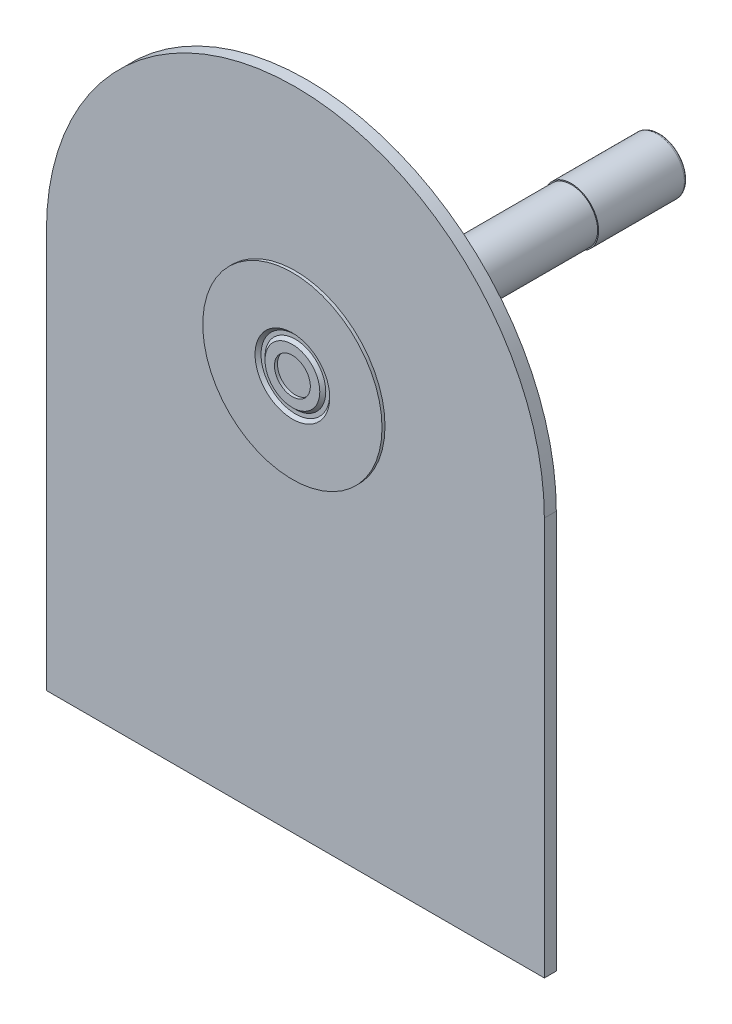
ISO-10303-21;
HEADER;
FILE_DESCRIPTION(('STEP AP214'),'2;1');
FILE_NAME('part.step','',(''),(''),'','','');
FILE_SCHEMA(('AUTOMOTIVE_DESIGN { 1 0 10303 214 1 1 1 1 }'));
ENDSEC;
DATA;
#1=APPLICATION_CONTEXT('core data for automotive mechanical design processes');
#2=APPLICATION_PROTOCOL_DEFINITION('international standard','automotive_design',2000,#1);
#3=PRODUCT_CONTEXT('',#1,'mechanical');
#4=PRODUCT('Part','Part','',(#3));
#5=PRODUCT_RELATED_PRODUCT_CATEGORY('part','',(#4));
#6=PRODUCT_DEFINITION_FORMATION('','',#4);
#7=PRODUCT_DEFINITION_CONTEXT('part definition',#1,'design');
#8=PRODUCT_DEFINITION('design','',#6,#7);
#9=PRODUCT_DEFINITION_SHAPE('','',#8);
#10=(LENGTH_UNIT() NAMED_UNIT(*) SI_UNIT(.MILLI.,.METRE.));
#11=(NAMED_UNIT(*) PLANE_ANGLE_UNIT() SI_UNIT($,.RADIAN.));
#12=(NAMED_UNIT(*) SI_UNIT($,.STERADIAN.) SOLID_ANGLE_UNIT());
#13=UNCERTAINTY_MEASURE_WITH_UNIT(LENGTH_MEASURE(1.E-05),#10,'distance_accuracy_value','');
#14=(GEOMETRIC_REPRESENTATION_CONTEXT(3) GLOBAL_UNCERTAINTY_ASSIGNED_CONTEXT((#13)) GLOBAL_UNIT_ASSIGNED_CONTEXT((#10,
#11,#12)) REPRESENTATION_CONTEXT('',''));
#15=CARTESIAN_POINT('',(0.,0.,0.));
#16=DIRECTION('',(0.,0.,1.));
#17=DIRECTION('',(1.,0.,0.));
#18=AXIS2_PLACEMENT_3D('',#15,#16,#17);
#19=CARTESIAN_POINT('',(0.,0.,355.));
#20=DIRECTION('',(0.,0.,1.));
#21=DIRECTION('',(1.,0.,0.));
#22=AXIS2_PLACEMENT_3D('',#19,#20,#21);
#23=CYLINDRICAL_SURFACE('',#22,250.);
#24=CARTESIAN_POINT('',(0.,0.,367.));
#25=DIRECTION('',(0.,0.,1.));
#26=DIRECTION('',(1.,0.,0.));
#27=AXIS2_PLACEMENT_3D('',#24,#25,#26);
#28=CIRCLE('',#27,250.);
#29=CARTESIAN_POINT('',(250.,0.,367.));
#30=VERTEX_POINT('',#29);
#31=CARTESIAN_POINT('',(-250.,0.,367.));
#32=VERTEX_POINT('',#31);
#33=EDGE_CURVE('E114',#30,#32,#28,.T.);
#34=ORIENTED_EDGE('',*,*,#33,.F.);
#35=DIRECTION('',(0.,0.,1.));
#36=VECTOR('',#35,1.);
#37=CARTESIAN_POINT('',(250.,0.,355.));
#38=LINE('',#37,#36);
#39=CARTESIAN_POINT('',(250.,0.,355.));
#40=VERTEX_POINT('',#39);
#41=EDGE_CURVE('E13',#40,#30,#38,.T.);
#42=ORIENTED_EDGE('',*,*,#41,.F.);
#43=CARTESIAN_POINT('',(0.,0.,355.));
#44=DIRECTION('',(0.,0.,1.));
#45=DIRECTION('',(1.,0.,0.));
#46=AXIS2_PLACEMENT_3D('',#43,#44,#45);
#47=CIRCLE('',#46,250.);
#48=CARTESIAN_POINT('',(-250.,0.,355.));
#49=VERTEX_POINT('',#48);
#50=EDGE_CURVE('E108',#40,#49,#47,.T.);
#51=ORIENTED_EDGE('',*,*,#50,.T.);
#52=DIRECTION('',(0.,0.,1.));
#53=VECTOR('',#52,1.);
#54=CARTESIAN_POINT('',(-250.,0.,355.));
#55=LINE('',#54,#53);
#56=EDGE_CURVE('E53',#49,#32,#55,.T.);
#57=ORIENTED_EDGE('',*,*,#56,.T.);
#58=EDGE_LOOP('',(#34,#42,#51,#57));
#59=FACE_BOUND('',#58,.T.);
#60=ADVANCED_FACE('F50',(#59),#23,.T.);
#61=CARTESIAN_POINT('',(250.,-400.,355.));
#62=DIRECTION('',(1.,0.,0.));
#63=DIRECTION('',(0.,0.,-1.));
#64=AXIS2_PLACEMENT_3D('',#61,#62,#63);
#65=PLANE('',#64);
#66=DIRECTION('',(0.,1.,0.));
#67=VECTOR('',#66,1.);
#68=CARTESIAN_POINT('',(250.,-400.,367.));
#69=LINE('',#68,#67);
#70=CARTESIAN_POINT('',(250.,-400.,367.));
#71=VERTEX_POINT('',#70);
#72=EDGE_CURVE('E110',#71,#30,#69,.T.);
#73=ORIENTED_EDGE('',*,*,#72,.F.);
#74=DIRECTION('',(0.,0.,1.));
#75=VECTOR('',#74,1.);
#76=CARTESIAN_POINT('',(250.,-400.,355.));
#77=LINE('',#76,#75);
#78=CARTESIAN_POINT('',(250.,-400.,355.));
#79=VERTEX_POINT('',#78);
#80=EDGE_CURVE('E59',#79,#71,#77,.T.);
#81=ORIENTED_EDGE('',*,*,#80,.F.);
#82=DIRECTION('',(0.,1.,0.));
#83=VECTOR('',#82,1.);
#84=CARTESIAN_POINT('',(250.,-400.,355.));
#85=LINE('',#84,#83);
#86=EDGE_CURVE('E105',#79,#40,#85,.T.);
#87=ORIENTED_EDGE('',*,*,#86,.T.);
#88=ORIENTED_EDGE('',*,*,#41,.T.);
#89=EDGE_LOOP('',(#73,#81,#87,#88));
#90=FACE_BOUND('',#89,.T.);
#91=ADVANCED_FACE('F124',(#90),#65,.T.);
#92=CARTESIAN_POINT('',(-250.,-400.,355.));
#93=DIRECTION('',(0.,-1.,0.));
#94=DIRECTION('',(0.,0.,-1.));
#95=AXIS2_PLACEMENT_3D('',#92,#93,#94);
#96=PLANE('',#95);
#97=DIRECTION('',(1.,0.,0.));
#98=VECTOR('',#97,1.);
#99=CARTESIAN_POINT('',(-250.,-400.,367.));
#100=LINE('',#99,#98);
#101=CARTESIAN_POINT('',(-250.,-400.,367.));
#102=VERTEX_POINT('',#101);
#103=EDGE_CURVE('E100',#102,#71,#100,.T.);
#104=ORIENTED_EDGE('',*,*,#103,.F.);
#105=DIRECTION('',(0.,0.,1.));
#106=VECTOR('',#105,1.);
#107=CARTESIAN_POINT('',(-250.,-400.,355.));
#108=LINE('',#107,#106);
#109=CARTESIAN_POINT('',(-250.,-400.,355.));
#110=VERTEX_POINT('',#109);
#111=EDGE_CURVE('E95',#110,#102,#108,.T.);
#112=ORIENTED_EDGE('',*,*,#111,.F.);
#113=DIRECTION('',(1.,0.,0.));
#114=VECTOR('',#113,1.);
#115=CARTESIAN_POINT('',(-250.,-400.,355.));
#116=LINE('',#115,#114);
#117=EDGE_CURVE('E98',#110,#79,#116,.T.);
#118=ORIENTED_EDGE('',*,*,#117,.T.);
#119=ORIENTED_EDGE('',*,*,#80,.T.);
#120=EDGE_LOOP('',(#104,#112,#118,#119));
#121=FACE_BOUND('',#120,.T.);
#122=ADVANCED_FACE('F97',(#121),#96,.T.);
#123=CARTESIAN_POINT('',(-250.,0.,355.));
#124=DIRECTION('',(-1.,0.,0.));
#125=DIRECTION('',(0.,0.,1.));
#126=AXIS2_PLACEMENT_3D('',#123,#124,#125);
#127=PLANE('',#126);
#128=DIRECTION('',(0.,-1.,0.));
#129=VECTOR('',#128,1.);
#130=CARTESIAN_POINT('',(-250.,0.,367.));
#131=LINE('',#130,#129);
#132=EDGE_CURVE('E117',#32,#102,#131,.T.);
#133=ORIENTED_EDGE('',*,*,#132,.F.);
#134=ORIENTED_EDGE('',*,*,#56,.F.);
#135=DIRECTION('',(0.,-1.,0.));
#136=VECTOR('',#135,1.);
#137=CARTESIAN_POINT('',(-250.,0.,355.));
#138=LINE('',#137,#136);
#139=EDGE_CURVE('E104',#49,#110,#138,.T.);
#140=ORIENTED_EDGE('',*,*,#139,.T.);
#141=ORIENTED_EDGE('',*,*,#111,.T.);
#142=EDGE_LOOP('',(#133,#134,#140,#141));
#143=FACE_BOUND('',#142,.T.);
#144=ADVANCED_FACE('F107',(#143),#127,.T.);
#145=CARTESIAN_POINT('',(0.,0.,355.));
#146=DIRECTION('',(0.,0.,1.));
#147=DIRECTION('',(1.,0.,0.));
#148=AXIS2_PLACEMENT_3D('',#145,#146,#147);
#149=PLANE('',#148);
#150=ORIENTED_EDGE('',*,*,#50,.F.);
#151=ORIENTED_EDGE('',*,*,#86,.F.);
#152=ORIENTED_EDGE('',*,*,#117,.F.);
#153=ORIENTED_EDGE('',*,*,#139,.F.);
#154=EDGE_LOOP('',(#150,#151,#152,#153));
#155=FACE_BOUND('',#154,.T.);
#156=ADVANCED_FACE('F103',(#155),#149,.F.);
#157=CARTESIAN_POINT('',(0.,0.,367.));
#158=DIRECTION('',(0.,0.,1.));
#159=DIRECTION('',(1.,0.,0.));
#160=AXIS2_PLACEMENT_3D('',#157,#158,#159);
#161=PLANE('',#160);
#162=ORIENTED_EDGE('',*,*,#33,.T.);
#163=ORIENTED_EDGE('',*,*,#132,.T.);
#164=ORIENTED_EDGE('',*,*,#103,.T.);
#165=ORIENTED_EDGE('',*,*,#72,.T.);
#166=EDGE_LOOP('',(#162,#163,#164,#165));
#167=FACE_BOUND('',#166,.T.);
#168=ADVANCED_FACE('F123',(#167),#161,.T.);
#169=CLOSED_SHELL('',(#60,#91,#122,#144,#156,#168));
#170=MANIFOLD_SOLID_BREP('B2',#169);
#171=CARTESIAN_POINT('',(0.,0.,350.));
#172=DIRECTION('',(0.,0.,1.));
#173=DIRECTION('',(1.,0.,0.));
#174=AXIS2_PLACEMENT_3D('',#171,#172,#173);
#175=CYLINDRICAL_SURFACE('',#174,150.);
#176=CARTESIAN_POINT('',(0.,0.,350.));
#177=DIRECTION('',(0.,0.,1.));
#178=DIRECTION('',(1.,0.,0.));
#179=AXIS2_PLACEMENT_3D('',#176,#177,#178);
#180=CIRCLE('',#179,150.);
#181=CARTESIAN_POINT('',(150.,0.,350.));
#182=VERTEX_POINT('',#181);
#183=EDGE_CURVE('E200',#182,#182,#180,.T.);
#184=ORIENTED_EDGE('',*,*,#183,.T.);
#185=EDGE_LOOP('',(#184));
#186=FACE_BOUND('',#185,.T.);
#187=CARTESIAN_POINT('',(0.,0.,367.));
#188=DIRECTION('',(0.,0.,1.));
#189=DIRECTION('',(1.,0.,0.));
#190=AXIS2_PLACEMENT_3D('',#187,#188,#189);
#191=CIRCLE('',#190,150.);
#192=CARTESIAN_POINT('',(150.,0.,367.));
#193=VERTEX_POINT('',#192);
#194=EDGE_CURVE('E198',#193,#193,#191,.F.);
#195=ORIENTED_EDGE('',*,*,#194,.T.);
#196=EDGE_LOOP('',(#195));
#197=FACE_BOUND('',#196,.T.);
#198=ADVANCED_FACE('F180',(#186,#197),#175,.T.);
#199=CARTESIAN_POINT('',(0.,0.,370.));
#200=DIRECTION('',(0.,0.,1.));
#201=DIRECTION('',(1.,0.,0.));
#202=AXIS2_PLACEMENT_3D('',#199,#200,#201);
#203=PLANE('',#202);
#204=CARTESIAN_POINT('',(0.,0.,370.));
#205=DIRECTION('',(0.,0.,1.));
#206=DIRECTION('',(1.,0.,0.));
#207=AXIS2_PLACEMENT_3D('',#204,#205,#206);
#208=CIRCLE('',#207,37.5);
#209=CARTESIAN_POINT('',(37.5,0.,370.));
#210=VERTEX_POINT('',#209);
#211=EDGE_CURVE('E187',#210,#210,#208,.F.);
#212=ORIENTED_EDGE('',*,*,#211,.T.);
#213=EDGE_LOOP('',(#212));
#214=FACE_BOUND('',#213,.T.);
#215=CARTESIAN_POINT('',(0.,0.,370.));
#216=DIRECTION('',(0.,0.,1.));
#217=DIRECTION('',(1.,0.,0.));
#218=AXIS2_PLACEMENT_3D('',#215,#216,#217);
#219=CIRCLE('',#218,90.);
#220=CARTESIAN_POINT('',(90.,0.,370.));
#221=VERTEX_POINT('',#220);
#222=EDGE_CURVE('E207',#221,#221,#219,.T.);
#223=ORIENTED_EDGE('',*,*,#222,.T.);
#224=EDGE_LOOP('',(#223));
#225=FACE_BOUND('',#224,.T.);
#226=ADVANCED_FACE('F293',(#214,#225),#203,.T.);
#227=CARTESIAN_POINT('',(0.,0.,350.));
#228=DIRECTION('',(0.,0.,1.));
#229=DIRECTION('',(1.,0.,0.));
#230=AXIS2_PLACEMENT_3D('',#227,#228,#229);
#231=PLANE('',#230);
#232=CARTESIAN_POINT('',(90.1561146012837,90.1561146012859,350.));
#233=DIRECTION('',(0.,0.,1.));
#234=DIRECTION('',(0.707106781186556,-0.707106781186539,0.));
#235=AXIS2_PLACEMENT_3D('',#232,#233,#234);
#236=CIRCLE('',#235,5.09999999999999);
#237=CARTESIAN_POINT('',(93.7623591853351,86.5498700172346,350.));
#238=VERTEX_POINT('',#237);
#239=EDGE_CURVE('E254',#238,#238,#236,.T.);
#240=ORIENTED_EDGE('',*,*,#239,.T.);
#241=EDGE_LOOP('',(#240));
#242=FACE_BOUND('',#241,.T.);
#243=CARTESIAN_POINT('',(127.5,1.34340712827385E-12,350.));
#244=DIRECTION('',(0.,0.,1.));
#245=DIRECTION('',(0.,-1.,0.));
#246=AXIS2_PLACEMENT_3D('',#243,#244,#245);
#247=CIRCLE('',#246,5.09999999999999);
#248=CARTESIAN_POINT('',(127.5,-5.09999999999864,350.));
#249=VERTEX_POINT('',#248);
#250=EDGE_CURVE('E248',#249,#249,#247,.T.);
#251=ORIENTED_EDGE('',*,*,#250,.T.);
#252=EDGE_LOOP('',(#251));
#253=FACE_BOUND('',#252,.T.);
#254=CARTESIAN_POINT('',(90.1561146012856,-90.156114601284,350.));
#255=DIRECTION('',(0.,0.,1.));
#256=DIRECTION('',(-0.707106781186541,-0.707106781186554,0.));
#257=AXIS2_PLACEMENT_3D('',#254,#255,#256);
#258=CIRCLE('',#257,5.09999999999999);
#259=CARTESIAN_POINT('',(86.5498700172342,-93.7623591853354,350.));
#260=VERTEX_POINT('',#259);
#261=EDGE_CURVE('E242',#260,#260,#258,.T.);
#262=ORIENTED_EDGE('',*,*,#261,.T.);
#263=EDGE_LOOP('',(#262));
#264=FACE_BOUND('',#263,.T.);
#265=CARTESIAN_POINT('',(0.,-127.5,350.));
#266=DIRECTION('',(0.,0.,1.));
#267=DIRECTION('',(-1.,0.,0.));
#268=AXIS2_PLACEMENT_3D('',#265,#266,#267);
#269=CIRCLE('',#268,5.09999999999999);
#270=CARTESIAN_POINT('',(-5.09999999999998,-127.5,350.));
#271=VERTEX_POINT('',#270);
#272=EDGE_CURVE('E236',#271,#271,#269,.T.);
#273=ORIENTED_EDGE('',*,*,#272,.T.);
#274=EDGE_LOOP('',(#273));
#275=FACE_BOUND('',#274,.T.);
#276=CARTESIAN_POINT('',(-90.1561146012843,-90.1561146012853,350.));
#277=DIRECTION('',(0.,0.,1.));
#278=DIRECTION('',(-0.707106781186551,0.707106781186544,0.));
#279=AXIS2_PLACEMENT_3D('',#276,#277,#278);
#280=CIRCLE('',#279,5.09999999999999);
#281=CARTESIAN_POINT('',(-93.7623591853357,-86.5498700172339,350.));
#282=VERTEX_POINT('',#281);
#283=EDGE_CURVE('E230',#282,#282,#280,.T.);
#284=ORIENTED_EDGE('',*,*,#283,.T.);
#285=EDGE_LOOP('',(#284));
#286=FACE_BOUND('',#285,.T.);
#287=CARTESIAN_POINT('',(-127.5,-4.53078871190961E-13,350.));
#288=DIRECTION('',(0.,0.,1.));
#289=DIRECTION('',(0.,1.,0.));
#290=AXIS2_PLACEMENT_3D('',#287,#288,#289);
#291=CIRCLE('',#290,5.09999999999999);
#292=CARTESIAN_POINT('',(-127.5,5.09999999999953,350.));
#293=VERTEX_POINT('',#292);
#294=EDGE_CURVE('E224',#293,#293,#291,.T.);
#295=ORIENTED_EDGE('',*,*,#294,.T.);
#296=EDGE_LOOP('',(#295));
#297=FACE_BOUND('',#296,.T.);
#298=CARTESIAN_POINT('',(-90.156114601285,90.1561146012846,350.));
#299=DIRECTION('',(0.,0.,1.));
#300=DIRECTION('',(0.707106781186546,0.707106781186549,0.));
#301=AXIS2_PLACEMENT_3D('',#298,#299,#300);
#302=CIRCLE('',#301,5.09999999999999);
#303=CARTESIAN_POINT('',(-86.5498700172336,93.762359185336,350.));
#304=VERTEX_POINT('',#303);
#305=EDGE_CURVE('E218',#304,#304,#302,.T.);
#306=ORIENTED_EDGE('',*,*,#305,.T.);
#307=EDGE_LOOP('',(#306));
#308=FACE_BOUND('',#307,.T.);
#309=CARTESIAN_POINT('',(0.,127.5,350.));
#310=DIRECTION('',(0.,0.,1.));
#311=DIRECTION('',(1.,0.,0.));
#312=AXIS2_PLACEMENT_3D('',#309,#310,#311);
#313=CIRCLE('',#312,5.09999999999999);
#314=CARTESIAN_POINT('',(5.09999999999998,127.5,350.));
#315=VERTEX_POINT('',#314);
#316=EDGE_CURVE('E210',#315,#315,#313,.T.);
#317=ORIENTED_EDGE('',*,*,#316,.T.);
#318=EDGE_LOOP('',(#317));
#319=FACE_BOUND('',#318,.T.);
#320=CARTESIAN_POINT('',(0.,0.,350.));
#321=DIRECTION('',(0.,0.,1.));
#322=DIRECTION('',(1.,0.,0.));
#323=AXIS2_PLACEMENT_3D('',#320,#321,#322);
#324=CIRCLE('',#323,37.5);
#325=CARTESIAN_POINT('',(37.5,0.,350.));
#326=VERTEX_POINT('',#325);
#327=EDGE_CURVE('E191',#326,#326,#324,.T.);
#328=ORIENTED_EDGE('',*,*,#327,.T.);
#329=EDGE_LOOP('',(#328));
#330=FACE_BOUND('',#329,.T.);
#331=ORIENTED_EDGE('',*,*,#183,.F.);
#332=EDGE_LOOP('',(#331));
#333=FACE_BOUND('',#332,.T.);
#334=ADVANCED_FACE('F295',(#242,#253,#264,#275,#286,#297,#308,#319,#330,#333),#231,.F.);
#335=CARTESIAN_POINT('',(0.,0.,370.));
#336=DIRECTION('',(0.,0.,-1.));
#337=DIRECTION('',(-1.,0.,0.));
#338=AXIS2_PLACEMENT_3D('',#335,#336,#337);
#339=CYLINDRICAL_SURFACE('',#338,32.5);
#340=CARTESIAN_POINT('',(0.,0.,365.));
#341=DIRECTION('',(0.,0.,1.));
#342=DIRECTION('',(1.,0.,0.));
#343=AXIS2_PLACEMENT_3D('',#340,#341,#342);
#344=CIRCLE('',#343,32.5);
#345=CARTESIAN_POINT('',(32.5,0.,365.));
#346=VERTEX_POINT('',#345);
#347=EDGE_CURVE('E49',#346,#346,#344,.T.);
#348=ORIENTED_EDGE('',*,*,#347,.T.);
#349=EDGE_LOOP('',(#348));
#350=FACE_BOUND('',#349,.T.);
#351=CARTESIAN_POINT('',(0.,0.,355.));
#352=DIRECTION('',(0.,0.,1.));
#353=DIRECTION('',(1.,0.,0.));
#354=AXIS2_PLACEMENT_3D('',#351,#352,#353);
#355=CIRCLE('',#354,32.5);
#356=CARTESIAN_POINT('',(32.5,0.,355.));
#357=VERTEX_POINT('',#356);
#358=EDGE_CURVE('E195',#357,#357,#355,.F.);
#359=ORIENTED_EDGE('',*,*,#358,.T.);
#360=EDGE_LOOP('',(#359));
#361=FACE_BOUND('',#360,.T.);
#362=ADVANCED_FACE('F301',(#350,#361),#339,.F.);
#363=CARTESIAN_POINT('',(0.,0.,355.));
#364=DIRECTION('',(0.,0.,-1.));
#365=DIRECTION('',(-1.,0.,0.));
#366=AXIS2_PLACEMENT_3D('',#363,#364,#365);
#367=CONICAL_SURFACE('',#366,32.5,0.785398163397446);
#368=ORIENTED_EDGE('',*,*,#327,.F.);
#369=EDGE_LOOP('',(#368));
#370=FACE_BOUND('',#369,.T.);
#371=ORIENTED_EDGE('',*,*,#358,.F.);
#372=EDGE_LOOP('',(#371));
#373=FACE_BOUND('',#372,.T.);
#374=ADVANCED_FACE('F268',(#370,#373),#367,.F.);
#375=CARTESIAN_POINT('',(0.,0.,367.));
#376=DIRECTION('',(0.,0.,1.));
#377=DIRECTION('',(1.,0.,0.));
#378=AXIS2_PLACEMENT_3D('',#375,#376,#377);
#379=PLANE('',#378);
#380=CARTESIAN_POINT('',(90.1561146012837,90.1561146012859,367.));
#381=DIRECTION('',(0.,0.,1.));
#382=DIRECTION('',(0.707106781186556,-0.707106781186539,0.));
#383=AXIS2_PLACEMENT_3D('',#380,#381,#382);
#384=CIRCLE('',#383,5.09999999999999);
#385=CARTESIAN_POINT('',(93.7623591853351,86.5498700172346,367.));
#386=VERTEX_POINT('',#385);
#387=EDGE_CURVE('E257',#386,#386,#384,.T.);
#388=ORIENTED_EDGE('',*,*,#387,.F.);
#389=EDGE_LOOP('',(#388));
#390=FACE_BOUND('',#389,.T.);
#391=CARTESIAN_POINT('',(127.5,1.34340712827385E-12,367.));
#392=DIRECTION('',(0.,0.,1.));
#393=DIRECTION('',(0.,-1.,0.));
#394=AXIS2_PLACEMENT_3D('',#391,#392,#393);
#395=CIRCLE('',#394,5.09999999999999);
#396=CARTESIAN_POINT('',(127.5,-5.09999999999864,367.));
#397=VERTEX_POINT('',#396);
#398=EDGE_CURVE('E251',#397,#397,#395,.T.);
#399=ORIENTED_EDGE('',*,*,#398,.F.);
#400=EDGE_LOOP('',(#399));
#401=FACE_BOUND('',#400,.T.);
#402=CARTESIAN_POINT('',(90.1561146012856,-90.156114601284,367.));
#403=DIRECTION('',(0.,0.,1.));
#404=DIRECTION('',(-0.707106781186541,-0.707106781186554,0.));
#405=AXIS2_PLACEMENT_3D('',#402,#403,#404);
#406=CIRCLE('',#405,5.09999999999999);
#407=CARTESIAN_POINT('',(86.5498700172342,-93.7623591853354,367.));
#408=VERTEX_POINT('',#407);
#409=EDGE_CURVE('E245',#408,#408,#406,.T.);
#410=ORIENTED_EDGE('',*,*,#409,.F.);
#411=EDGE_LOOP('',(#410));
#412=FACE_BOUND('',#411,.T.);
#413=CARTESIAN_POINT('',(0.,-127.5,367.));
#414=DIRECTION('',(0.,0.,1.));
#415=DIRECTION('',(-1.,0.,0.));
#416=AXIS2_PLACEMENT_3D('',#413,#414,#415);
#417=CIRCLE('',#416,5.09999999999999);
#418=CARTESIAN_POINT('',(-5.09999999999998,-127.5,367.));
#419=VERTEX_POINT('',#418);
#420=EDGE_CURVE('E239',#419,#419,#417,.T.);
#421=ORIENTED_EDGE('',*,*,#420,.F.);
#422=EDGE_LOOP('',(#421));
#423=FACE_BOUND('',#422,.T.);
#424=CARTESIAN_POINT('',(-90.1561146012843,-90.1561146012853,367.));
#425=DIRECTION('',(0.,0.,1.));
#426=DIRECTION('',(-0.707106781186551,0.707106781186544,0.));
#427=AXIS2_PLACEMENT_3D('',#424,#425,#426);
#428=CIRCLE('',#427,5.09999999999999);
#429=CARTESIAN_POINT('',(-93.7623591853357,-86.5498700172339,367.));
#430=VERTEX_POINT('',#429);
#431=EDGE_CURVE('E233',#430,#430,#428,.T.);
#432=ORIENTED_EDGE('',*,*,#431,.F.);
#433=EDGE_LOOP('',(#432));
#434=FACE_BOUND('',#433,.T.);
#435=CARTESIAN_POINT('',(-127.5,-4.53078871190961E-13,367.));
#436=DIRECTION('',(0.,0.,1.));
#437=DIRECTION('',(0.,1.,0.));
#438=AXIS2_PLACEMENT_3D('',#435,#436,#437);
#439=CIRCLE('',#438,5.09999999999999);
#440=CARTESIAN_POINT('',(-127.5,5.09999999999953,367.));
#441=VERTEX_POINT('',#440);
#442=EDGE_CURVE('E227',#441,#441,#439,.T.);
#443=ORIENTED_EDGE('',*,*,#442,.F.);
#444=EDGE_LOOP('',(#443));
#445=FACE_BOUND('',#444,.T.);
#446=CARTESIAN_POINT('',(-90.156114601285,90.1561146012846,367.));
#447=DIRECTION('',(0.,0.,1.));
#448=DIRECTION('',(0.707106781186546,0.707106781186549,0.));
#449=AXIS2_PLACEMENT_3D('',#446,#447,#448);
#450=CIRCLE('',#449,5.09999999999999);
#451=CARTESIAN_POINT('',(-86.5498700172336,93.762359185336,367.));
#452=VERTEX_POINT('',#451);
#453=EDGE_CURVE('E221',#452,#452,#450,.T.);
#454=ORIENTED_EDGE('',*,*,#453,.F.);
#455=EDGE_LOOP('',(#454));
#456=FACE_BOUND('',#455,.T.);
#457=CARTESIAN_POINT('',(0.,127.5,367.));
#458=DIRECTION('',(0.,0.,1.));
#459=DIRECTION('',(1.,0.,0.));
#460=AXIS2_PLACEMENT_3D('',#457,#458,#459);
#461=CIRCLE('',#460,5.09999999999999);
#462=CARTESIAN_POINT('',(5.09999999999998,127.5,367.));
#463=VERTEX_POINT('',#462);
#464=EDGE_CURVE('E215',#463,#463,#461,.T.);
#465=ORIENTED_EDGE('',*,*,#464,.F.);
#466=EDGE_LOOP('',(#465));
#467=FACE_BOUND('',#466,.T.);
#468=ORIENTED_EDGE('',*,*,#194,.F.);
#469=EDGE_LOOP('',(#468));
#470=FACE_BOUND('',#469,.T.);
#471=CARTESIAN_POINT('',(0.,0.,367.));
#472=DIRECTION('',(0.,0.,1.));
#473=DIRECTION('',(1.,0.,0.));
#474=AXIS2_PLACEMENT_3D('',#471,#472,#473);
#475=CIRCLE('',#474,90.);
#476=CARTESIAN_POINT('',(90.,0.,367.));
#477=VERTEX_POINT('',#476);
#478=EDGE_CURVE('E201',#477,#477,#475,.T.);
#479=ORIENTED_EDGE('',*,*,#478,.F.);
#480=EDGE_LOOP('',(#479));
#481=FACE_BOUND('',#480,.T.);
#482=ADVANCED_FACE('F264',(#390,#401,#412,#423,#434,#445,#456,#467,#470,#481),#379,.T.);
#483=CARTESIAN_POINT('',(0.,0.,367.));
#484=DIRECTION('',(0.,0.,1.));
#485=DIRECTION('',(1.,0.,0.));
#486=AXIS2_PLACEMENT_3D('',#483,#484,#485);
#487=CYLINDRICAL_SURFACE('',#486,90.);
#488=ORIENTED_EDGE('',*,*,#478,.T.);
#489=EDGE_LOOP('',(#488));
#490=FACE_BOUND('',#489,.T.);
#491=ORIENTED_EDGE('',*,*,#222,.F.);
#492=EDGE_LOOP('',(#491));
#493=FACE_BOUND('',#492,.T.);
#494=ADVANCED_FACE('F267',(#490,#493),#487,.T.);
#495=CARTESIAN_POINT('',(0.,0.,370.));
#496=DIRECTION('',(0.,0.,1.));
#497=DIRECTION('',(1.,0.,0.));
#498=AXIS2_PLACEMENT_3D('',#495,#496,#497);
#499=CONICAL_SURFACE('',#498,37.5,0.785398163397446);
#500=ORIENTED_EDGE('',*,*,#347,.F.);
#501=EDGE_LOOP('',(#500));
#502=FACE_BOUND('',#501,.T.);
#503=ORIENTED_EDGE('',*,*,#211,.F.);
#504=EDGE_LOOP('',(#503));
#505=FACE_BOUND('',#504,.T.);
#506=ADVANCED_FACE('F182',(#502,#505),#499,.F.);
#507=CARTESIAN_POINT('',(0.,127.5,367.));
#508=DIRECTION('',(0.,0.,1.));
#509=DIRECTION('',(1.,0.,0.));
#510=AXIS2_PLACEMENT_3D('',#507,#508,#509);
#511=CYLINDRICAL_SURFACE('',#510,5.09999999999999);
#512=ORIENTED_EDGE('',*,*,#464,.T.);
#513=EDGE_LOOP('',(#512));
#514=FACE_BOUND('',#513,.T.);
#515=ORIENTED_EDGE('',*,*,#316,.F.);
#516=EDGE_LOOP('',(#515));
#517=FACE_BOUND('',#516,.T.);
#518=ADVANCED_FACE('F323',(#514,#517),#511,.F.);
#519=CARTESIAN_POINT('',(-90.156114601285,90.1561146012846,367.));
#520=DIRECTION('',(0.,0.,1.));
#521=DIRECTION('',(0.707106781186546,0.707106781186549,0.));
#522=AXIS2_PLACEMENT_3D('',#519,#520,#521);
#523=CYLINDRICAL_SURFACE('',#522,5.09999999999999);
#524=ORIENTED_EDGE('',*,*,#453,.T.);
#525=EDGE_LOOP('',(#524));
#526=FACE_BOUND('',#525,.T.);
#527=ORIENTED_EDGE('',*,*,#305,.F.);
#528=EDGE_LOOP('',(#527));
#529=FACE_BOUND('',#528,.T.);
#530=ADVANCED_FACE('F326',(#526,#529),#523,.F.);
#531=CARTESIAN_POINT('',(-127.5,-4.53078871190961E-13,367.));
#532=DIRECTION('',(0.,0.,1.));
#533=DIRECTION('',(0.,1.,0.));
#534=AXIS2_PLACEMENT_3D('',#531,#532,#533);
#535=CYLINDRICAL_SURFACE('',#534,5.09999999999999);
#536=ORIENTED_EDGE('',*,*,#442,.T.);
#537=EDGE_LOOP('',(#536));
#538=FACE_BOUND('',#537,.T.);
#539=ORIENTED_EDGE('',*,*,#294,.F.);
#540=EDGE_LOOP('',(#539));
#541=FACE_BOUND('',#540,.T.);
#542=ADVANCED_FACE('F330',(#538,#541),#535,.F.);
#543=CARTESIAN_POINT('',(-90.1561146012843,-90.1561146012853,367.));
#544=DIRECTION('',(0.,0.,1.));
#545=DIRECTION('',(-0.707106781186551,0.707106781186544,0.));
#546=AXIS2_PLACEMENT_3D('',#543,#544,#545);
#547=CYLINDRICAL_SURFACE('',#546,5.09999999999999);
#548=ORIENTED_EDGE('',*,*,#431,.T.);
#549=EDGE_LOOP('',(#548));
#550=FACE_BOUND('',#549,.T.);
#551=ORIENTED_EDGE('',*,*,#283,.F.);
#552=EDGE_LOOP('',(#551));
#553=FACE_BOUND('',#552,.T.);
#554=ADVANCED_FACE('F334',(#550,#553),#547,.F.);
#555=CARTESIAN_POINT('',(0.,-127.5,367.));
#556=DIRECTION('',(0.,0.,1.));
#557=DIRECTION('',(-1.,0.,0.));
#558=AXIS2_PLACEMENT_3D('',#555,#556,#557);
#559=CYLINDRICAL_SURFACE('',#558,5.09999999999999);
#560=ORIENTED_EDGE('',*,*,#420,.T.);
#561=EDGE_LOOP('',(#560));
#562=FACE_BOUND('',#561,.T.);
#563=ORIENTED_EDGE('',*,*,#272,.F.);
#564=EDGE_LOOP('',(#563));
#565=FACE_BOUND('',#564,.T.);
#566=ADVANCED_FACE('F338',(#562,#565),#559,.F.);
#567=CARTESIAN_POINT('',(90.1561146012856,-90.156114601284,367.));
#568=DIRECTION('',(0.,0.,1.));
#569=DIRECTION('',(-0.707106781186541,-0.707106781186554,0.));
#570=AXIS2_PLACEMENT_3D('',#567,#568,#569);
#571=CYLINDRICAL_SURFACE('',#570,5.09999999999999);
#572=ORIENTED_EDGE('',*,*,#409,.T.);
#573=EDGE_LOOP('',(#572));
#574=FACE_BOUND('',#573,.T.);
#575=ORIENTED_EDGE('',*,*,#261,.F.);
#576=EDGE_LOOP('',(#575));
#577=FACE_BOUND('',#576,.T.);
#578=ADVANCED_FACE('F342',(#574,#577),#571,.F.);
#579=CARTESIAN_POINT('',(127.5,1.34340712827385E-12,367.));
#580=DIRECTION('',(0.,0.,1.));
#581=DIRECTION('',(0.,-1.,0.));
#582=AXIS2_PLACEMENT_3D('',#579,#580,#581);
#583=CYLINDRICAL_SURFACE('',#582,5.09999999999999);
#584=ORIENTED_EDGE('',*,*,#398,.T.);
#585=EDGE_LOOP('',(#584));
#586=FACE_BOUND('',#585,.T.);
#587=ORIENTED_EDGE('',*,*,#250,.F.);
#588=EDGE_LOOP('',(#587));
#589=FACE_BOUND('',#588,.T.);
#590=ADVANCED_FACE('F346',(#586,#589),#583,.F.);
#591=CARTESIAN_POINT('',(90.1561146012837,90.1561146012859,367.));
#592=DIRECTION('',(0.,0.,1.));
#593=DIRECTION('',(0.707106781186556,-0.707106781186539,0.));
#594=AXIS2_PLACEMENT_3D('',#591,#592,#593);
#595=CYLINDRICAL_SURFACE('',#594,5.09999999999999);
#596=ORIENTED_EDGE('',*,*,#387,.T.);
#597=EDGE_LOOP('',(#596));
#598=FACE_BOUND('',#597,.T.);
#599=ORIENTED_EDGE('',*,*,#239,.F.);
#600=EDGE_LOOP('',(#599));
#601=FACE_BOUND('',#600,.T.);
#602=ADVANCED_FACE('F261',(#598,#601),#595,.F.);
#603=CLOSED_SHELL('',(#198,#226,#334,#362,#374,#482,#494,#506,#518,#530,#542,#554,#566,#578,
#590,#602));
#604=MANIFOLD_SOLID_BREP('B7',#603);
#605=CARTESIAN_POINT('',(0.,0.,90.));
#606=DIRECTION('',(0.,0.,1.));
#607=DIRECTION('',(1.,0.,0.));
#608=AXIS2_PLACEMENT_3D('',#605,#606,#607);
#609=PLANE('',#608);
#610=CARTESIAN_POINT('',(0.,0.,90.));
#611=DIRECTION('',(0.,0.,1.));
#612=DIRECTION('',(1.,0.,0.));
#613=AXIS2_PLACEMENT_3D('',#610,#611,#612);
#614=CIRCLE('',#613,27.5);
#615=CARTESIAN_POINT('',(-27.5,0.,90.));
#616=VERTEX_POINT('',#615);
#617=EDGE_CURVE('E508',#616,#616,#614,.T.);
#618=ORIENTED_EDGE('',*,*,#617,.T.);
#619=EDGE_LOOP('',(#618));
#620=FACE_BOUND('',#619,.T.);
#621=CARTESIAN_POINT('',(0.,0.,90.));
#622=DIRECTION('',(0.,0.,1.));
#623=DIRECTION('',(1.,0.,0.));
#624=AXIS2_PLACEMENT_3D('',#621,#622,#623);
#625=CIRCLE('',#624,26.5);
#626=CARTESIAN_POINT('',(26.5,0.,90.));
#627=VERTEX_POINT('',#626);
#628=EDGE_CURVE('E512',#627,#627,#625,.T.);
#629=ORIENTED_EDGE('',*,*,#628,.F.);
#630=EDGE_LOOP('',(#629));
#631=FACE_BOUND('',#630,.T.);
#632=ADVANCED_FACE('F485',(#620,#631),#609,.T.);
#633=CARTESIAN_POINT('',(0.,0.,90.));
#634=DIRECTION('',(0.,0.,-1.));
#635=DIRECTION('',(-1.,0.,0.));
#636=AXIS2_PLACEMENT_3D('',#633,#634,#635);
#637=CYLINDRICAL_SURFACE('',#636,27.5);
#638=CARTESIAN_POINT('',(0.,0.,3.92531435122802));
#639=DIRECTION('',(0.,0.,-1.));
#640=DIRECTION('',(-1.,0.,0.));
#641=AXIS2_PLACEMENT_3D('',#638,#639,#640);
#642=CIRCLE('',#641,27.5);
#643=CARTESIAN_POINT('',(-27.5,0.,3.92531435122802));
#644=VERTEX_POINT('',#643);
#645=EDGE_CURVE('E492',#644,#644,#642,.F.);
#646=CARTESIAN_POINT('',(-27.5,0.,3.92531435122802));
#647=CARTESIAN_POINT('',(-27.5,0.,4.82192566006939));
#648=CARTESIAN_POINT('',(-27.5,0.,5.71853696891077));
#649=CARTESIAN_POINT('',(-27.5,0.,7.51175958659352));
#650=CARTESIAN_POINT('',(-27.5,0.,8.40837089543489));
#651=CARTESIAN_POINT('',(-27.5,0.,10.2015935131176));
#652=CARTESIAN_POINT('',(-27.5,0.,11.098204821959));
#653=CARTESIAN_POINT('',(-27.5,0.,12.8914274396418));
#654=CARTESIAN_POINT('',(-27.5,0.,13.7880387484831));
#655=CARTESIAN_POINT('',(-27.5,0.,15.5812613661659));
#656=CARTESIAN_POINT('',(-27.5,0.,16.4778726750073));
#657=CARTESIAN_POINT('',(-27.5,0.,18.27109529269));
#658=CARTESIAN_POINT('',(-27.5,0.,19.1677066015314));
#659=CARTESIAN_POINT('',(-27.5,0.,20.9609292192141));
#660=CARTESIAN_POINT('',(-27.5,0.,21.8575405280555));
#661=CARTESIAN_POINT('',(-27.5,0.,23.6507631457383));
#662=CARTESIAN_POINT('',(-27.5,0.,24.5473744545796));
#663=CARTESIAN_POINT('',(-27.5,0.,26.3405970722624));
#664=CARTESIAN_POINT('',(-27.5,0.,27.2372083811038));
#665=CARTESIAN_POINT('',(-27.5,0.,29.0304309987865));
#666=CARTESIAN_POINT('',(-27.5,0.,29.9270423076279));
#667=CARTESIAN_POINT('',(-27.5,0.,31.7202649253106));
#668=CARTESIAN_POINT('',(-27.5,0.,32.616876234152));
#669=CARTESIAN_POINT('',(-27.5,0.,34.4100988518347));
#670=CARTESIAN_POINT('',(-27.5,0.,35.3067101606761));
#671=CARTESIAN_POINT('',(-27.5,0.,37.0999327783589));
#672=CARTESIAN_POINT('',(-27.5,0.,37.9965440872003));
#673=CARTESIAN_POINT('',(-27.5,0.,39.789766704883));
#674=CARTESIAN_POINT('',(-27.5,0.,40.6863780137244));
#675=CARTESIAN_POINT('',(-27.5,0.,42.4796006314071));
#676=CARTESIAN_POINT('',(-27.5,0.,43.3762119402485));
#677=CARTESIAN_POINT('',(-27.5,0.,45.1694345579313));
#678=CARTESIAN_POINT('',(-27.5,0.,46.0660458667726));
#679=CARTESIAN_POINT('',(-27.5,0.,47.8592684844554));
#680=CARTESIAN_POINT('',(-27.5,0.,48.7558797932967));
#681=CARTESIAN_POINT('',(-27.5,0.,50.5491024109795));
#682=CARTESIAN_POINT('',(-27.5,0.,51.4457137198209));
#683=CARTESIAN_POINT('',(-27.5,0.,53.2389363375036));
#684=CARTESIAN_POINT('',(-27.5,0.,54.135547646345));
#685=CARTESIAN_POINT('',(-27.5,0.,55.9287702640277));
#686=CARTESIAN_POINT('',(-27.5,0.,56.8253815728691));
#687=CARTESIAN_POINT('',(-27.5,0.,58.6186041905519));
#688=CARTESIAN_POINT('',(-27.5,0.,59.5152154993932));
#689=CARTESIAN_POINT('',(-27.5,0.,61.308438117076));
#690=CARTESIAN_POINT('',(-27.5,0.,62.2050494259174));
#691=CARTESIAN_POINT('',(-27.5,0.,63.9982720436001));
#692=CARTESIAN_POINT('',(-27.5,0.,64.8948833524415));
#693=CARTESIAN_POINT('',(-27.5,0.,66.6881059701242));
#694=CARTESIAN_POINT('',(-27.5,0.,67.5847172789656));
#695=CARTESIAN_POINT('',(-27.5,0.,69.3779398966484));
#696=CARTESIAN_POINT('',(-27.5,0.,70.2745512054897));
#697=CARTESIAN_POINT('',(-27.5,0.,72.0677738231725));
#698=CARTESIAN_POINT('',(-27.5,0.,72.9643851320139));
#699=CARTESIAN_POINT('',(-27.5,0.,74.7576077496966));
#700=CARTESIAN_POINT('',(-27.5,0.,75.654219058538));
#701=CARTESIAN_POINT('',(-27.5,0.,77.4474416762207));
#702=CARTESIAN_POINT('',(-27.5,0.,78.3440529850621));
#703=CARTESIAN_POINT('',(-27.5,0.,80.1372756027449));
#704=CARTESIAN_POINT('',(-27.5,0.,81.0338869115862));
#705=CARTESIAN_POINT('',(-27.5,0.,82.827109529269));
#706=CARTESIAN_POINT('',(-27.5,0.,83.7237208381104));
#707=CARTESIAN_POINT('',(-27.5,0.,85.5169434557931));
#708=CARTESIAN_POINT('',(-27.5,0.,86.4135547646345));
#709=CARTESIAN_POINT('',(-27.5,0.,88.2067773823172));
#710=CARTESIAN_POINT('',(-27.5,0.,89.1033886911586));
#711=CARTESIAN_POINT('',(-27.5,0.,90.));
#712=B_SPLINE_CURVE_WITH_KNOTS('',3,(#646,#647,#648,#649,#650,#651,#652,#653,#654,#655,#656,
#657,#658,#659,#660,#661,#662,#663,#664,#665,#666,#667,#668,#669,#670,#671,#672,#673,#674,#675,
#676,#677,#678,#679,#680,#681,#682,#683,#684,#685,#686,#687,#688,#689,#690,#691,#692,#693,#694,
#695,#696,#697,#698,#699,#700,#701,#702,#703,#704,#705,#706,#707,#708,#709,#710,#711),
.UNSPECIFIED.,.F.,.F.,(4,2,2,2,2,2,2,2,2,2,2,2,2,2,2,2,2,2,2,2,2,2,2,2,2,2,2,2,2,2,2,2,4),(0.,
2.68983392652412,5.37966785304825,8.06950177957237,10.7593357060965,13.4491696326206,
16.1390035591447,18.8288374856689,21.518671412193,24.2085053387171,26.8983392652412,
29.5881731917654,32.2780071182895,34.9678410448136,37.6576749713377,40.3475088978619,
43.037342824386,45.7271767509101,48.4170106774342,51.1068446039584,53.7966785304825,
56.4865124570066,59.1763463835307,61.8661803100549,64.556014236579,67.2458481631031,
69.9356820896272,72.6255160161514,75.3153499426755,78.0051838691996,80.6950177957237,
83.3848517222478,86.074685648772),.UNSPECIFIED.);
#713=EDGE_CURVE('BSEAM547',#644,#616,#712,.T.);
#714=ORIENTED_EDGE('',*,*,#645,.T.);
#715=ORIENTED_EDGE('',*,*,#617,.F.);
#716=ORIENTED_EDGE('',*,*,#713,.T.);
#717=ORIENTED_EDGE('',*,*,#713,.F.);
#718=EDGE_LOOP('',(#714,#716,#715,#717));
#719=FACE_BOUND('',#718,.T.);
#720=ADVANCED_FACE('F547',(#719),#637,.T.);
#721=CARTESIAN_POINT('',(0.,0.,280.));
#722=DIRECTION('',(0.,0.,-1.));
#723=DIRECTION('',(-1.,0.,0.));
#724=AXIS2_PLACEMENT_3D('',#721,#722,#723);
#725=CYLINDRICAL_SURFACE('',#724,26.5);
#726=CARTESIAN_POINT('',(0.,0.,280.));
#727=DIRECTION('',(0.,0.,1.));
#728=DIRECTION('',(1.,0.,0.));
#729=AXIS2_PLACEMENT_3D('',#726,#727,#728);
#730=CIRCLE('',#729,26.5);
#731=CARTESIAN_POINT('',(26.5,0.,280.));
#732=VERTEX_POINT('',#731);
#733=EDGE_CURVE('E511',#732,#732,#730,.T.);
#734=ORIENTED_EDGE('',*,*,#733,.F.);
#735=EDGE_LOOP('',(#734));
#736=FACE_BOUND('',#735,.T.);
#737=ORIENTED_EDGE('',*,*,#628,.T.);
#738=EDGE_LOOP('',(#737));
#739=FACE_BOUND('',#738,.T.);
#740=ADVANCED_FACE('F553',(#736,#739),#725,.T.);
#741=CARTESIAN_POINT('',(0.,0.,280.));
#742=DIRECTION('',(0.,0.,1.));
#743=DIRECTION('',(1.,0.,0.));
#744=AXIS2_PLACEMENT_3D('',#741,#742,#743);
#745=PLANE('',#744);
#746=CARTESIAN_POINT('',(0.,0.,280.));
#747=DIRECTION('',(0.,0.,1.));
#748=DIRECTION('',(1.,0.,0.));
#749=AXIS2_PLACEMENT_3D('',#746,#747,#748);
#750=CIRCLE('',#749,27.5);
#751=CARTESIAN_POINT('',(27.5,0.,280.));
#752=VERTEX_POINT('',#751);
#753=EDGE_CURVE('E518',#752,#752,#750,.T.);
#754=ORIENTED_EDGE('',*,*,#753,.F.);
#755=EDGE_LOOP('',(#754));
#756=FACE_BOUND('',#755,.T.);
#757=ORIENTED_EDGE('',*,*,#733,.T.);
#758=EDGE_LOOP('',(#757));
#759=FACE_BOUND('',#758,.T.);
#760=ADVANCED_FACE('F559',(#756,#759),#745,.F.);
#761=CARTESIAN_POINT('',(0.,0.,340.));
#762=DIRECTION('',(0.,0.,-1.));
#763=DIRECTION('',(-1.,0.,0.));
#764=AXIS2_PLACEMENT_3D('',#761,#762,#763);
#765=CYLINDRICAL_SURFACE('',#764,27.5);
#766=CARTESIAN_POINT('',(0.,0.,340.));
#767=DIRECTION('',(0.,0.,1.));
#768=DIRECTION('',(1.,0.,0.));
#769=AXIS2_PLACEMENT_3D('',#766,#767,#768);
#770=CIRCLE('',#769,27.5);
#771=CARTESIAN_POINT('',(27.5,0.,340.));
#772=VERTEX_POINT('',#771);
#773=EDGE_CURVE('E515',#772,#772,#770,.T.);
#774=ORIENTED_EDGE('',*,*,#773,.F.);
#775=EDGE_LOOP('',(#774));
#776=FACE_BOUND('',#775,.T.);
#777=ORIENTED_EDGE('',*,*,#753,.T.);
#778=EDGE_LOOP('',(#777));
#779=FACE_BOUND('',#778,.T.);
#780=ADVANCED_FACE('F561',(#776,#779),#765,.T.);
#781=CARTESIAN_POINT('',(0.,0.,340.));
#782=DIRECTION('',(0.,0.,1.));
#783=DIRECTION('',(1.,0.,0.));
#784=AXIS2_PLACEMENT_3D('',#781,#782,#783);
#785=PLANE('',#784);
#786=CARTESIAN_POINT('',(0.,0.,340.));
#787=DIRECTION('',(0.,0.,1.));
#788=DIRECTION('',(1.,0.,0.));
#789=AXIS2_PLACEMENT_3D('',#786,#787,#788);
#790=CIRCLE('',#789,32.5);
#791=CARTESIAN_POINT('',(32.5,0.,340.));
#792=VERTEX_POINT('',#791);
#793=EDGE_CURVE('E521',#792,#792,#790,.T.);
#794=ORIENTED_EDGE('',*,*,#793,.F.);
#795=EDGE_LOOP('',(#794));
#796=FACE_BOUND('',#795,.T.);
#797=ORIENTED_EDGE('',*,*,#773,.T.);
#798=EDGE_LOOP('',(#797));
#799=FACE_BOUND('',#798,.T.);
#800=ADVANCED_FACE('F564',(#796,#799),#785,.F.);
#801=CARTESIAN_POINT('',(0.,0.,370.));
#802=DIRECTION('',(0.,0.,-1.));
#803=DIRECTION('',(-1.,0.,0.));
#804=AXIS2_PLACEMENT_3D('',#801,#802,#803);
#805=CYLINDRICAL_SURFACE('',#804,32.5);
#806=CARTESIAN_POINT('',(0.,0.,365.));
#807=DIRECTION('',(0.,0.,1.));
#808=DIRECTION('',(1.,0.,0.));
#809=AXIS2_PLACEMENT_3D('',#806,#807,#808);
#810=CIRCLE('',#809,32.5);
#811=CARTESIAN_POINT('',(32.5,0.,365.));
#812=VERTEX_POINT('',#811);
#813=EDGE_CURVE('E500',#812,#812,#810,.F.);
#814=ORIENTED_EDGE('',*,*,#813,.T.);
#815=EDGE_LOOP('',(#814));
#816=FACE_BOUND('',#815,.T.);
#817=ORIENTED_EDGE('',*,*,#793,.T.);
#818=EDGE_LOOP('',(#817));
#819=FACE_BOUND('',#818,.T.);
#820=ADVANCED_FACE('F569',(#816,#819),#805,.T.);
#821=CARTESIAN_POINT('',(0.,0.,370.));
#822=DIRECTION('',(0.,0.,1.));
#823=DIRECTION('',(1.,0.,0.));
#824=AXIS2_PLACEMENT_3D('',#821,#822,#823);
#825=PLANE('',#824);
#826=CARTESIAN_POINT('',(0.,0.,370.));
#827=DIRECTION('',(0.,0.,-1.));
#828=DIRECTION('',(-1.,0.,0.));
#829=AXIS2_PLACEMENT_3D('',#826,#827,#828);
#830=CIRCLE('',#829,18.);
#831=CARTESIAN_POINT('',(-18.,0.,370.));
#832=VERTEX_POINT('',#831);
#833=EDGE_CURVE('E526',#832,#832,#830,.T.);
#834=ORIENTED_EDGE('',*,*,#833,.T.);
#835=EDGE_LOOP('',(#834));
#836=FACE_BOUND('',#835,.T.);
#837=CARTESIAN_POINT('',(0.,0.,370.));
#838=DIRECTION('',(0.,0.,1.));
#839=DIRECTION('',(1.,0.,0.));
#840=AXIS2_PLACEMENT_3D('',#837,#838,#839);
#841=CIRCLE('',#840,27.5);
#842=CARTESIAN_POINT('',(27.5,0.,370.));
#843=VERTEX_POINT('',#842);
#844=EDGE_CURVE('E505',#843,#843,#841,.T.);
#845=ORIENTED_EDGE('',*,*,#844,.T.);
#846=EDGE_LOOP('',(#845));
#847=FACE_BOUND('',#846,.T.);
#848=ADVANCED_FACE('F530',(#836,#847),#825,.T.);
#849=CARTESIAN_POINT('',(0.,0.,370.));
#850=DIRECTION('',(0.,0.,-1.));
#851=DIRECTION('',(-1.,0.,0.));
#852=AXIS2_PLACEMENT_3D('',#849,#850,#851);
#853=CONICAL_SURFACE('',#852,27.5,0.785398163397446);
#854=ORIENTED_EDGE('',*,*,#813,.F.);
#855=EDGE_LOOP('',(#854));
#856=FACE_BOUND('',#855,.T.);
#857=ORIENTED_EDGE('',*,*,#844,.F.);
#858=EDGE_LOOP('',(#857));
#859=FACE_BOUND('',#858,.T.);
#860=ADVANCED_FACE('F536',(#856,#859),#853,.T.);
#861=CARTESIAN_POINT('',(0.,0.,370.));
#862=DIRECTION('',(0.,0.,-1.));
#863=DIRECTION('',(-1.,0.,0.));
#864=AXIS2_PLACEMENT_3D('',#861,#862,#863);
#865=CYLINDRICAL_SURFACE('',#864,18.);
#866=CARTESIAN_POINT('',(0.,0.,9.9874921777191));
#867=DIRECTION('',(0.,0.,-1.));
#868=DIRECTION('',(-1.,0.,0.));
#869=AXIS2_PLACEMENT_3D('',#866,#867,#868);
#870=CIRCLE('',#869,18.);
#871=CARTESIAN_POINT('',(-18.,0.,9.9874921777191));
#872=VERTEX_POINT('',#871);
#873=EDGE_CURVE('E496',#872,#872,#870,.T.);
#874=ORIENTED_EDGE('',*,*,#873,.T.);
#875=EDGE_LOOP('',(#874));
#876=FACE_BOUND('',#875,.T.);
#877=ORIENTED_EDGE('',*,*,#833,.F.);
#878=EDGE_LOOP('',(#877));
#879=FACE_BOUND('',#878,.T.);
#880=ADVANCED_FACE('F533',(#876,#879),#865,.F.);
#881=CARTESIAN_POINT('',(0.,0.,9.98749217771909));
#882=DIRECTION('',(0.,0.,-1.));
#883=DIRECTION('',(-1.,0.,0.));
#884=AXIS2_PLACEMENT_3D('',#881,#882,#883);
#885=TOROIDAL_SURFACE('',#884,28.,10.);
#886=CARTESIAN_POINT('',(0.,0.,1.32723813987471));
#887=DIRECTION('',(0.,0.,1.));
#888=DIRECTION('',(1.,0.,0.));
#889=AXIS2_PLACEMENT_3D('',#886,#887,#888);
#890=CIRCLE('',#889,23.);
#891=CARTESIAN_POINT('',(23.,0.,1.32723813987471));
#892=VERTEX_POINT('',#891);
#893=EDGE_CURVE('E179',#892,#892,#890,.F.);
#894=ORIENTED_EDGE('',*,*,#893,.T.);
#895=EDGE_LOOP('',(#894));
#896=FACE_BOUND('',#895,.T.);
#897=ORIENTED_EDGE('',*,*,#873,.F.);
#898=EDGE_LOOP('',(#897));
#899=FACE_BOUND('',#898,.T.);
#900=ADVANCED_FACE('F535',(#896,#899),#885,.T.);
#901=CARTESIAN_POINT('',(0.,0.,3.92531435122802));
#902=DIRECTION('',(0.,0.,-1.));
#903=DIRECTION('',(-1.,0.,0.));
#904=AXIS2_PLACEMENT_3D('',#901,#902,#903);
#905=TOROIDAL_SURFACE('',#904,24.5,3.);
#906=ORIENTED_EDGE('',*,*,#893,.F.);
#907=EDGE_LOOP('',(#906));
#908=FACE_BOUND('',#907,.T.);
#909=ORIENTED_EDGE('',*,*,#645,.F.);
#910=EDGE_LOOP('',(#909));
#911=FACE_BOUND('',#910,.T.);
#912=ADVANCED_FACE('F487',(#908,#911),#905,.T.);
#913=CLOSED_SHELL('',(#632,#720,#740,#760,#780,#800,#820,#848,#860,#880,#900,#912));
#914=MANIFOLD_SOLID_BREP('B44',#913);
#915=ADVANCED_BREP_SHAPE_REPRESENTATION('',(#18,#170,#604,#914),#14);
#916=SHAPE_DEFINITION_REPRESENTATION(#9,#915);
ENDSEC;
END-ISO-10303-21;
